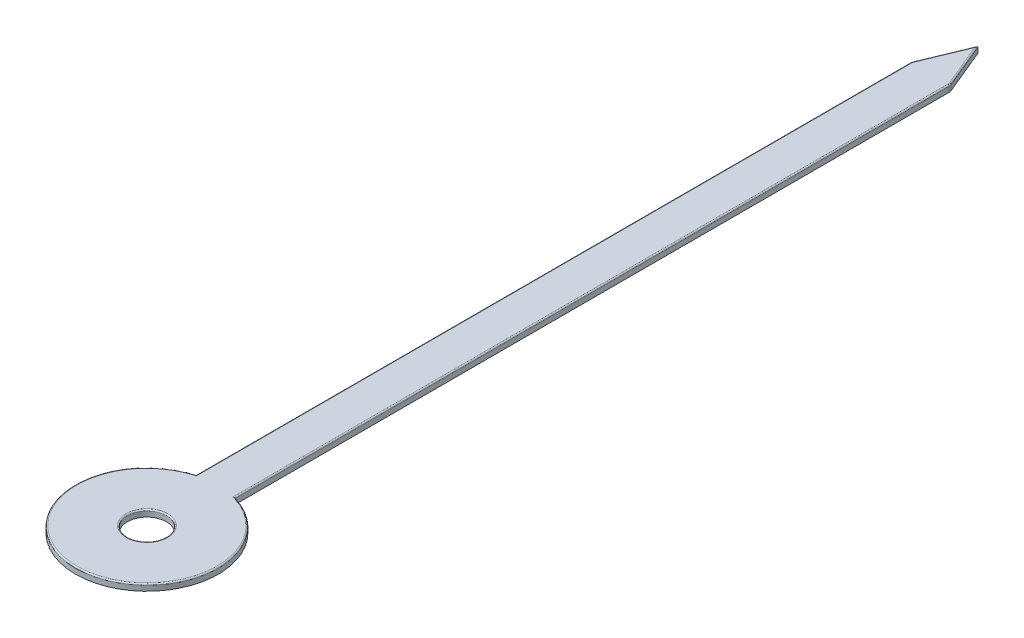
ISO-10303-21;
HEADER;
FILE_DESCRIPTION(('STEP AP214'),'2;1');
FILE_NAME('part.step','',(''),(''),'','','');
FILE_SCHEMA(('AUTOMOTIVE_DESIGN { 1 0 10303 214 1 1 1 1 }'));
ENDSEC;
DATA;
#1=APPLICATION_CONTEXT('core data for automotive mechanical design processes');
#2=APPLICATION_PROTOCOL_DEFINITION('international standard','automotive_design',2000,#1);
#3=PRODUCT_CONTEXT('',#1,'mechanical');
#4=PRODUCT('Part','Part','',(#3));
#5=PRODUCT_RELATED_PRODUCT_CATEGORY('part','',(#4));
#6=PRODUCT_DEFINITION_FORMATION('','',#4);
#7=PRODUCT_DEFINITION_CONTEXT('part definition',#1,'design');
#8=PRODUCT_DEFINITION('design','',#6,#7);
#9=PRODUCT_DEFINITION_SHAPE('','',#8);
#10=(LENGTH_UNIT() NAMED_UNIT(*) SI_UNIT(.MILLI.,.METRE.));
#11=(NAMED_UNIT(*) PLANE_ANGLE_UNIT() SI_UNIT($,.RADIAN.));
#12=(NAMED_UNIT(*) SI_UNIT($,.STERADIAN.) SOLID_ANGLE_UNIT());
#13=UNCERTAINTY_MEASURE_WITH_UNIT(LENGTH_MEASURE(1.E-05),#10,'distance_accuracy_value','');
#14=(GEOMETRIC_REPRESENTATION_CONTEXT(3) GLOBAL_UNCERTAINTY_ASSIGNED_CONTEXT((#13)) GLOBAL_UNIT_ASSIGNED_CONTEXT((#10,
#11,#12)) REPRESENTATION_CONTEXT('',''));
#15=CARTESIAN_POINT('',(0.,0.,0.));
#16=DIRECTION('',(0.,0.,1.));
#17=DIRECTION('',(1.,0.,0.));
#18=AXIS2_PLACEMENT_3D('',#15,#16,#17);
#19=CARTESIAN_POINT('',(0.,0.1,0.));
#20=DIRECTION('',(0.,1.,0.));
#21=DIRECTION('',(0.,0.,1.));
#22=AXIS2_PLACEMENT_3D('',#19,#20,#21);
#23=PLANE('',#22);
#24=CARTESIAN_POINT('',(0.,0.1,0.));
#25=DIRECTION('',(0.,1.,0.));
#26=DIRECTION('',(0.,0.,1.));
#27=AXIS2_PLACEMENT_3D('',#24,#25,#26);
#28=CIRCLE('',#27,0.32);
#29=CARTESIAN_POINT('',(0.,0.1,0.32));
#30=VERTEX_POINT('',#29);
#31=EDGE_CURVE('E188',#30,#30,#28,.F.);
#32=ORIENTED_EDGE('',*,*,#31,.T.);
#33=EDGE_LOOP('',(#32));
#34=FACE_BOUND('',#33,.T.);
#35=CARTESIAN_POINT('',(0.2,0.1,-12.0558446945501));
#36=DIRECTION('',(0.,1.,0.));
#37=DIRECTION('',(0.,0.,1.));
#38=AXIS2_PLACEMENT_3D('',#35,#36,#37);
#39=CIRCLE('',#38,0.08);
#40=CARTESIAN_POINT('',(0.28,0.1,-12.0558446945501));
#41=VERTEX_POINT('',#40);
#42=CARTESIAN_POINT('',(0.273910362600903,0.1,-12.0864593691393));
#43=VERTEX_POINT('',#42);
#44=EDGE_CURVE('E183',#41,#43,#39,.T.);
#45=ORIENTED_EDGE('',*,*,#44,.T.);
#46=DIRECTION('',(-0.382683432365087,0.,-0.923879532511288));
#47=VECTOR('',#46,1.);
#48=CARTESIAN_POINT('',(-0.0184775906502269,0.1,-12.7923463313527));
#49=LINE('',#48,#47);
#50=CARTESIAN_POINT('',(0.,0.1,-12.7477374814049));
#51=VERTEX_POINT('',#50);
#52=EDGE_CURVE('E185',#43,#51,#49,.T.);
#53=ORIENTED_EDGE('',*,*,#52,.T.);
#54=DIRECTION('',(-0.382683432365087,0.,0.923879532511288));
#55=VECTOR('',#54,1.);
#56=CARTESIAN_POINT('',(-0.273910362600902,0.1,-12.0864593691393));
#57=LINE('',#56,#55);
#58=CARTESIAN_POINT('',(-0.273910362600902,0.1,-12.0864593691393));
#59=VERTEX_POINT('',#58);
#60=EDGE_CURVE('E173',#51,#59,#57,.T.);
#61=ORIENTED_EDGE('',*,*,#60,.T.);
#62=CARTESIAN_POINT('',(-0.2,0.1,-12.0558446945501));
#63=DIRECTION('',(0.,1.,0.));
#64=DIRECTION('',(0.,0.,1.));
#65=AXIS2_PLACEMENT_3D('',#62,#63,#64);
#66=CIRCLE('',#65,0.08);
#67=CARTESIAN_POINT('',(-0.28,0.1,-12.0558446945501));
#68=VERTEX_POINT('',#67);
#69=EDGE_CURVE('E175',#59,#68,#66,.T.);
#70=ORIENTED_EDGE('',*,*,#69,.T.);
#71=DIRECTION('',(0.,0.,1.));
#72=VECTOR('',#71,1.);
#73=CARTESIAN_POINT('',(-0.28,0.1,-1.05830052442584));
#74=LINE('',#73,#72);
#75=CARTESIAN_POINT('',(-0.28,0.1,-1.04307238483242));
#76=VERTEX_POINT('',#75);
#77=EDGE_CURVE('E177',#68,#76,#74,.T.);
#78=ORIENTED_EDGE('',*,*,#77,.T.);
#79=CARTESIAN_POINT('',(0.,0.1,0.));
#80=DIRECTION('',(0.,1.,0.));
#81=DIRECTION('',(0.,0.,1.));
#82=AXIS2_PLACEMENT_3D('',#79,#80,#81);
#83=CIRCLE('',#82,1.08);
#84=CARTESIAN_POINT('',(0.28,0.1,-1.04307238483242));
#85=VERTEX_POINT('',#84);
#86=EDGE_CURVE('E179',#76,#85,#83,.T.);
#87=ORIENTED_EDGE('',*,*,#86,.T.);
#88=DIRECTION('',(0.,0.,-1.));
#89=VECTOR('',#88,1.);
#90=CARTESIAN_POINT('',(0.28,0.1,-12.0558446945501));
#91=LINE('',#90,#89);
#92=EDGE_CURVE('E181',#85,#41,#91,.T.);
#93=ORIENTED_EDGE('',*,*,#92,.T.);
#94=EDGE_LOOP('',(#45,#53,#61,#70,#78,#87,#93));
#95=FACE_BOUND('',#94,.T.);
#96=ADVANCED_FACE('F33',(#34,#95),#23,.T.);
#97=CARTESIAN_POINT('',(0.,0.,0.));
#98=DIRECTION('',(0.,1.,0.));
#99=DIRECTION('',(0.,0.,1.));
#100=AXIS2_PLACEMENT_3D('',#97,#98,#99);
#101=PLANE('',#100);
#102=DIRECTION('',(0.,0.,1.));
#103=VECTOR('',#102,1.);
#104=CARTESIAN_POINT('',(-0.3,0.,-1.05830052442584));
#105=LINE('',#104,#103);
#106=CARTESIAN_POINT('',(-0.3,0.,-12.0558446945501));
#107=VERTEX_POINT('',#106);
#108=CARTESIAN_POINT('',(-0.3,0.,-1.05830052442584));
#109=VERTEX_POINT('',#108);
#110=EDGE_CURVE('E145',#107,#109,#105,.T.);
#111=ORIENTED_EDGE('',*,*,#110,.F.);
#112=CARTESIAN_POINT('',(-0.2,0.,-12.0558446945501));
#113=DIRECTION('',(0.,1.,0.));
#114=DIRECTION('',(0.,0.,1.));
#115=AXIS2_PLACEMENT_3D('',#112,#113,#114);
#116=CIRCLE('',#115,0.1);
#117=CARTESIAN_POINT('',(-0.292387953251128,0.,-12.0941130377866));
#118=VERTEX_POINT('',#117);
#119=EDGE_CURVE('E144',#107,#118,#116,.F.);
#120=ORIENTED_EDGE('',*,*,#119,.T.);
#121=DIRECTION('',(-0.382683432365087,0.,0.923879532511288));
#122=VECTOR('',#121,1.);
#123=CARTESIAN_POINT('',(-0.3,0.,-12.0757359312881));
#124=LINE('',#123,#122);
#125=CARTESIAN_POINT('',(0.,0.,-12.8));
#126=VERTEX_POINT('',#125);
#127=EDGE_CURVE('E123',#126,#118,#124,.T.);
#128=ORIENTED_EDGE('',*,*,#127,.F.);
#129=DIRECTION('',(-0.382683432365087,0.,-0.923879532511288));
#130=VECTOR('',#129,1.);
#131=CARTESIAN_POINT('',(0.,0.,-12.8));
#132=LINE('',#131,#130);
#133=CARTESIAN_POINT('',(0.292387953251129,0.,-12.0941130377866));
#134=VERTEX_POINT('',#133);
#135=EDGE_CURVE('E132',#134,#126,#132,.T.);
#136=ORIENTED_EDGE('',*,*,#135,.F.);
#137=CARTESIAN_POINT('',(0.2,0.,-12.0558446945501));
#138=DIRECTION('',(0.,1.,0.));
#139=DIRECTION('',(0.,0.,1.));
#140=AXIS2_PLACEMENT_3D('',#137,#138,#139);
#141=CIRCLE('',#140,0.1);
#142=CARTESIAN_POINT('',(0.3,0.,-12.0558446945501));
#143=VERTEX_POINT('',#142);
#144=EDGE_CURVE('E161',#134,#143,#141,.F.);
#145=ORIENTED_EDGE('',*,*,#144,.T.);
#146=DIRECTION('',(0.,0.,-1.));
#147=VECTOR('',#146,1.);
#148=CARTESIAN_POINT('',(0.3,0.,-1.05830052442584));
#149=LINE('',#148,#147);
#150=CARTESIAN_POINT('',(0.300000000000001,0.,-1.05830052442584));
#151=VERTEX_POINT('',#150);
#152=EDGE_CURVE('E154',#151,#143,#149,.T.);
#153=ORIENTED_EDGE('',*,*,#152,.F.);
#154=CARTESIAN_POINT('',(0.,0.,0.));
#155=DIRECTION('',(0.,1.,0.));
#156=DIRECTION('',(0.,0.,1.));
#157=AXIS2_PLACEMENT_3D('',#154,#155,#156);
#158=CIRCLE('',#157,1.1);
#159=EDGE_CURVE('E148',#109,#151,#158,.T.);
#160=ORIENTED_EDGE('',*,*,#159,.F.);
#161=EDGE_LOOP('',(#111,#120,#128,#136,#145,#153,#160));
#162=FACE_BOUND('',#161,.T.);
#163=CARTESIAN_POINT('',(0.,0.,0.));
#164=DIRECTION('',(0.,1.,0.));
#165=DIRECTION('',(0.,0.,1.));
#166=AXIS2_PLACEMENT_3D('',#163,#164,#165);
#167=CIRCLE('',#166,0.3);
#168=CARTESIAN_POINT('',(0.,0.,0.3));
#169=VERTEX_POINT('',#168);
#170=EDGE_CURVE('E138',#169,#169,#167,.T.);
#171=ORIENTED_EDGE('',*,*,#170,.T.);
#172=EDGE_LOOP('',(#171));
#173=FACE_BOUND('',#172,.T.);
#174=ADVANCED_FACE('F141',(#162,#173),#101,.F.);
#175=CARTESIAN_POINT('',(0.,0.1,-12.8));
#176=DIRECTION('',(-0.923879532511288,0.,0.382683432365087));
#177=DIRECTION('',(0.382683432365087,0.,0.923879532511288));
#178=AXIS2_PLACEMENT_3D('',#175,#176,#177);
#179=PLANE('',#178);
#180=DIRECTION('',(0.,-1.,0.));
#181=VECTOR('',#180,1.);
#182=CARTESIAN_POINT('',(0.,0.1,-12.8));
#183=LINE('',#182,#181);
#184=CARTESIAN_POINT('',(0.,0.08,-12.8));
#185=VERTEX_POINT('',#184);
#186=EDGE_CURVE('E119',#185,#126,#183,.T.);
#187=ORIENTED_EDGE('',*,*,#186,.F.);
#188=DIRECTION('',(-0.382683432365087,0.,-0.923879532511288));
#189=VECTOR('',#188,1.);
#190=CARTESIAN_POINT('',(0.292387953251129,0.08,-12.0941130377866));
#191=LINE('',#190,#189);
#192=CARTESIAN_POINT('',(0.292387953251129,0.08,-12.0941130377866));
#193=VERTEX_POINT('',#192);
#194=EDGE_CURVE('E191',#185,#193,#191,.F.);
#195=ORIENTED_EDGE('',*,*,#194,.T.);
#196=DIRECTION('',(0.,-1.,0.));
#197=VECTOR('',#196,1.);
#198=CARTESIAN_POINT('',(0.292387953251129,0.1,-12.0941130377866));
#199=LINE('',#198,#197);
#200=EDGE_CURVE('E135',#193,#134,#199,.T.);
#201=ORIENTED_EDGE('',*,*,#200,.T.);
#202=ORIENTED_EDGE('',*,*,#135,.T.);
#203=EDGE_LOOP('',(#187,#195,#201,#202));
#204=FACE_BOUND('',#203,.T.);
#205=ADVANCED_FACE('F133',(#204),#179,.F.);
#206=CARTESIAN_POINT('',(-0.3,0.1,-12.0757359312881));
#207=DIRECTION('',(0.923879532511288,0.,0.382683432365087));
#208=DIRECTION('',(0.382683432365087,0.,-0.923879532511288));
#209=AXIS2_PLACEMENT_3D('',#206,#207,#208);
#210=PLANE('',#209);
#211=DIRECTION('',(0.,-1.,0.));
#212=VECTOR('',#211,1.);
#213=CARTESIAN_POINT('',(-0.292387953251128,0.1,-12.0941130377866));
#214=LINE('',#213,#212);
#215=CARTESIAN_POINT('',(-0.292387953251128,0.08,-12.0941130377866));
#216=VERTEX_POINT('',#215);
#217=EDGE_CURVE('E164',#118,#216,#214,.F.);
#218=ORIENTED_EDGE('',*,*,#217,.T.);
#219=DIRECTION('',(-0.382683432365087,0.,0.923879532511288));
#220=VECTOR('',#219,1.);
#221=CARTESIAN_POINT('',(0.,0.08,-12.8));
#222=LINE('',#221,#220);
#223=EDGE_CURVE('E11',#216,#185,#222,.F.);
#224=ORIENTED_EDGE('',*,*,#223,.T.);
#225=ORIENTED_EDGE('',*,*,#186,.T.);
#226=ORIENTED_EDGE('',*,*,#127,.T.);
#227=EDGE_LOOP('',(#218,#224,#225,#226));
#228=FACE_BOUND('',#227,.T.);
#229=ADVANCED_FACE('F121',(#228),#210,.F.);
#230=CARTESIAN_POINT('',(-0.3,0.1,-1.05830052442584));
#231=DIRECTION('',(1.,0.,0.));
#232=DIRECTION('',(0.,0.,-1.));
#233=AXIS2_PLACEMENT_3D('',#230,#231,#232);
#234=PLANE('',#233);
#235=DIRECTION('',(0.,-1.,0.));
#236=VECTOR('',#235,1.);
#237=CARTESIAN_POINT('',(-0.3,0.1,-1.05830052442584));
#238=LINE('',#237,#236);
#239=CARTESIAN_POINT('',(-0.3,0.08,-1.05830052442584));
#240=VERTEX_POINT('',#239);
#241=EDGE_CURVE('E129',#240,#109,#238,.T.);
#242=ORIENTED_EDGE('',*,*,#241,.F.);
#243=DIRECTION('',(0.,0.,1.));
#244=VECTOR('',#243,1.);
#245=CARTESIAN_POINT('',(-0.3,0.08,-12.0558446945501));
#246=LINE('',#245,#244);
#247=CARTESIAN_POINT('',(-0.3,0.08,-12.0558446945501));
#248=VERTEX_POINT('',#247);
#249=EDGE_CURVE('E61',#240,#248,#246,.F.);
#250=ORIENTED_EDGE('',*,*,#249,.T.);
#251=DIRECTION('',(0.,-1.,0.));
#252=VECTOR('',#251,1.);
#253=CARTESIAN_POINT('',(-0.3,0.1,-12.0558446945501));
#254=LINE('',#253,#252);
#255=EDGE_CURVE('E128',#248,#107,#254,.T.);
#256=ORIENTED_EDGE('',*,*,#255,.T.);
#257=ORIENTED_EDGE('',*,*,#110,.T.);
#258=EDGE_LOOP('',(#242,#250,#256,#257));
#259=FACE_BOUND('',#258,.T.);
#260=ADVANCED_FACE('F255',(#259),#234,.F.);
#261=CARTESIAN_POINT('',(0.,0.1,0.));
#262=DIRECTION('',(0.,-1.,0.));
#263=DIRECTION('',(0.,0.,-1.));
#264=AXIS2_PLACEMENT_3D('',#261,#262,#263);
#265=CYLINDRICAL_SURFACE('',#264,1.1);
#266=DIRECTION('',(0.,-1.,0.));
#267=VECTOR('',#266,1.);
#268=CARTESIAN_POINT('',(0.300000000000001,0.1,-1.05830052442584));
#269=LINE('',#268,#267);
#270=CARTESIAN_POINT('',(0.300000000000001,0.08,-1.05830052442584));
#271=VERTEX_POINT('',#270);
#272=EDGE_CURVE('E157',#271,#151,#269,.T.);
#273=ORIENTED_EDGE('',*,*,#272,.F.);
#274=CARTESIAN_POINT('',(0.,0.08,0.));
#275=DIRECTION('',(0.,1.,0.));
#276=DIRECTION('',(0.,0.,1.));
#277=AXIS2_PLACEMENT_3D('',#274,#275,#276);
#278=CIRCLE('',#277,1.1);
#279=EDGE_CURVE('E197',#271,#240,#278,.F.);
#280=ORIENTED_EDGE('',*,*,#279,.T.);
#281=ORIENTED_EDGE('',*,*,#241,.T.);
#282=ORIENTED_EDGE('',*,*,#159,.T.);
#283=EDGE_LOOP('',(#273,#280,#281,#282));
#284=FACE_BOUND('',#283,.T.);
#285=ADVANCED_FACE('F251',(#284),#265,.T.);
#286=CARTESIAN_POINT('',(0.3,0.1,-1.05830052442584));
#287=DIRECTION('',(-1.,0.,0.));
#288=DIRECTION('',(0.,0.,1.));
#289=AXIS2_PLACEMENT_3D('',#286,#287,#288);
#290=PLANE('',#289);
#291=DIRECTION('',(0.,-1.,0.));
#292=VECTOR('',#291,1.);
#293=CARTESIAN_POINT('',(0.3,0.1,-12.0558446945501));
#294=LINE('',#293,#292);
#295=CARTESIAN_POINT('',(0.3,0.08,-12.0558446945501));
#296=VERTEX_POINT('',#295);
#297=EDGE_CURVE('E167',#143,#296,#294,.F.);
#298=ORIENTED_EDGE('',*,*,#297,.T.);
#299=DIRECTION('',(0.,0.,-1.));
#300=VECTOR('',#299,1.);
#301=CARTESIAN_POINT('',(0.3,0.08,-1.05830052442584));
#302=LINE('',#301,#300);
#303=EDGE_CURVE('E195',#296,#271,#302,.F.);
#304=ORIENTED_EDGE('',*,*,#303,.T.);
#305=ORIENTED_EDGE('',*,*,#272,.T.);
#306=ORIENTED_EDGE('',*,*,#152,.T.);
#307=EDGE_LOOP('',(#298,#304,#305,#306));
#308=FACE_BOUND('',#307,.T.);
#309=ADVANCED_FACE('F248',(#308),#290,.F.);
#310=CARTESIAN_POINT('',(0.,0.1,0.));
#311=DIRECTION('',(0.,-1.,0.));
#312=DIRECTION('',(0.,0.,-1.));
#313=AXIS2_PLACEMENT_3D('',#310,#311,#312);
#314=CYLINDRICAL_SURFACE('',#313,0.3);
#315=CARTESIAN_POINT('',(0.,0.08,0.));
#316=DIRECTION('',(0.,1.,0.));
#317=DIRECTION('',(0.,0.,1.));
#318=AXIS2_PLACEMENT_3D('',#315,#316,#317);
#319=CIRCLE('',#318,0.3);
#320=CARTESIAN_POINT('',(0.,0.08,0.3));
#321=VERTEX_POINT('',#320);
#322=EDGE_CURVE('E170',#321,#321,#319,.T.);
#323=ORIENTED_EDGE('',*,*,#322,.T.);
#324=EDGE_LOOP('',(#323));
#325=FACE_BOUND('',#324,.T.);
#326=ORIENTED_EDGE('',*,*,#170,.F.);
#327=EDGE_LOOP('',(#326));
#328=FACE_BOUND('',#327,.T.);
#329=ADVANCED_FACE('F246',(#325,#328),#314,.F.);
#330=CARTESIAN_POINT('',(-0.2,0.1,-12.0558446945501));
#331=DIRECTION('',(0.,-1.,0.));
#332=DIRECTION('',(0.,0.,-1.));
#333=AXIS2_PLACEMENT_3D('',#330,#331,#332);
#334=CYLINDRICAL_SURFACE('',#333,0.1);
#335=ORIENTED_EDGE('',*,*,#255,.F.);
#336=CARTESIAN_POINT('',(-0.2,0.08,-12.0558446945501));
#337=DIRECTION('',(0.,1.,0.));
#338=DIRECTION('',(0.,0.,1.));
#339=AXIS2_PLACEMENT_3D('',#336,#337,#338);
#340=CIRCLE('',#339,0.1);
#341=EDGE_CURVE('E46',#248,#216,#340,.F.);
#342=ORIENTED_EDGE('',*,*,#341,.T.);
#343=ORIENTED_EDGE('',*,*,#217,.F.);
#344=ORIENTED_EDGE('',*,*,#119,.F.);
#345=EDGE_LOOP('',(#335,#342,#343,#344));
#346=FACE_BOUND('',#345,.T.);
#347=ADVANCED_FACE('F263',(#346),#334,.T.);
#348=CARTESIAN_POINT('',(0.2,0.1,-12.0558446945501));
#349=DIRECTION('',(0.,-1.,0.));
#350=DIRECTION('',(0.,0.,-1.));
#351=AXIS2_PLACEMENT_3D('',#348,#349,#350);
#352=CYLINDRICAL_SURFACE('',#351,0.1);
#353=ORIENTED_EDGE('',*,*,#200,.F.);
#354=CARTESIAN_POINT('',(0.2,0.08,-12.0558446945501));
#355=DIRECTION('',(0.,1.,0.));
#356=DIRECTION('',(0.,0.,1.));
#357=AXIS2_PLACEMENT_3D('',#354,#355,#356);
#358=CIRCLE('',#357,0.1);
#359=EDGE_CURVE('E193',#193,#296,#358,.F.);
#360=ORIENTED_EDGE('',*,*,#359,.T.);
#361=ORIENTED_EDGE('',*,*,#297,.F.);
#362=ORIENTED_EDGE('',*,*,#144,.F.);
#363=EDGE_LOOP('',(#353,#360,#361,#362));
#364=FACE_BOUND('',#363,.T.);
#365=ADVANCED_FACE('F233',(#364),#352,.T.);
#366=CARTESIAN_POINT('',(0.,0.08,0.));
#367=DIRECTION('',(0.,1.,0.));
#368=DIRECTION('',(0.,0.,1.));
#369=AXIS2_PLACEMENT_3D('',#366,#367,#368);
#370=TOROIDAL_SURFACE('',#369,0.32,0.02);
#371=ORIENTED_EDGE('',*,*,#31,.F.);
#372=EDGE_LOOP('',(#371));
#373=FACE_BOUND('',#372,.T.);
#374=ORIENTED_EDGE('',*,*,#322,.F.);
#375=EDGE_LOOP('',(#374));
#376=FACE_BOUND('',#375,.T.);
#377=ADVANCED_FACE('F225',(#373,#376),#370,.T.);
#378=CARTESIAN_POINT('',(0.,0.08,0.));
#379=DIRECTION('',(0.,1.,0.));
#380=DIRECTION('',(0.,0.,1.));
#381=AXIS2_PLACEMENT_3D('',#378,#379,#380);
#382=TOROIDAL_SURFACE('',#381,1.08,0.02);
#383=CARTESIAN_POINT('',(0.300000000000001,0.08,-1.05830052442584));
#384=CARTESIAN_POINT('',(0.300001434378571,0.0809645688605814,-1.05830159455923));
#385=CARTESIAN_POINT('',(0.299930324263026,0.0819275496760335,-1.05824785472071));
#386=CARTESIAN_POINT('',(0.299654974451375,0.0838173916784719,-1.05803968620466));
#387=CARTESIAN_POINT('',(0.299451536768023,0.0847444350397026,-1.05788586410554));
#388=CARTESIAN_POINT('',(0.298923654477688,0.0865402750858273,-1.05748658820793));
#389=CARTESIAN_POINT('',(0.298599401405258,0.0874091614115095,-1.05724127944714));
#390=CARTESIAN_POINT('',(0.297846766369355,0.0890734614440091,-1.05667161774031));
#391=CARTESIAN_POINT('',(0.297418246898693,0.0898687761966275,-1.05634716041116));
#392=CARTESIAN_POINT('',(0.296441672727979,0.0914269950518833,-1.05560732379475));
#393=CARTESIAN_POINT('',(0.295887303948224,0.092183620319212,-1.05518713438536));
#394=CARTESIAN_POINT('',(0.294700543420221,0.0935920192230769,-1.05428699714139));
#395=CARTESIAN_POINT('',(0.294068136897373,0.0942437729506876,-1.05380703799065));
#396=CARTESIAN_POINT('',(0.292615145226683,0.0955560922797399,-1.05270346799454));
#397=CARTESIAN_POINT('',(0.29178177545773,0.0961941800877155,-1.05206999351507));
#398=CARTESIAN_POINT('',(0.290053252420723,0.0973204668900287,-1.05075479452971));
#399=CARTESIAN_POINT('',(0.289158017136094,0.0978084620464117,-1.05007300594098));
#400=CARTESIAN_POINT('',(0.287035539936965,0.0987684488891805,-1.04845491380227));
#401=CARTESIAN_POINT('',(0.285793011282463,0.0991863320057,-1.0475064398017));
#402=CARTESIAN_POINT('',(0.283274570186935,0.0997723508641512,-1.04558129383254));
#403=CARTESIAN_POINT('',(0.281998707810397,0.0999408414420839,-1.04460466394651));
#404=CARTESIAN_POINT('',(0.280481479306558,0.0999956527269803,-1.04344161719734));
#405=CARTESIAN_POINT('',(0.280240693528984,0.0999999967729995,-1.04325699080301));
#406=CARTESIAN_POINT('',(0.28,0.1,-1.04307238483242));
#407=B_SPLINE_CURVE_WITH_KNOTS('',3,(#383,#384,#385,#386,#387,#388,#389,#390,#391,#392,#393,
#394,#395,#396,#397,#398,#399,#400,#401,#402,#403,#404,#405,#406),.UNSPECIFIED.,.F.,.F.,(4,2,2,
2,2,2,2,2,2,2,2,4),(0.,0.00288708863402028,0.00575684018464619,0.00862206140247126,
0.0114910819703431,0.0145631804207026,0.017635861395187,0.0213003193172393,0.0249697321160903,
0.0298023186017101,0.034628022645949,0.035538238261908),.UNSPECIFIED.);
#408=EDGE_CURVE('E213',#85,#271,#407,.F.);
#409=ORIENTED_EDGE('',*,*,#408,.F.);
#410=ORIENTED_EDGE('',*,*,#86,.F.);
#411=CARTESIAN_POINT('',(-0.3,0.08,-1.05830052442584));
#412=CARTESIAN_POINT('',(-0.300001434378571,0.0809645688605814,-1.05830159455923));
#413=CARTESIAN_POINT('',(-0.299930324263026,0.0819275496760335,-1.05824785472071));
#414=CARTESIAN_POINT('',(-0.299654974451375,0.0838173916784719,-1.05803968620466));
#415=CARTESIAN_POINT('',(-0.299451536768023,0.0847444350397026,-1.05788586410554));
#416=CARTESIAN_POINT('',(-0.298923654477688,0.0865402750858273,-1.05748658820793));
#417=CARTESIAN_POINT('',(-0.298599401405258,0.0874091614115095,-1.05724127944714));
#418=CARTESIAN_POINT('',(-0.297846766369355,0.0890734614440091,-1.05667161774031));
#419=CARTESIAN_POINT('',(-0.297418246898693,0.0898687761966275,-1.05634716041116));
#420=CARTESIAN_POINT('',(-0.296441672727979,0.0914269950518833,-1.05560732379475));
#421=CARTESIAN_POINT('',(-0.295887303948224,0.092183620319212,-1.05518713438536));
#422=CARTESIAN_POINT('',(-0.294700543420221,0.0935920192230769,-1.05428699714139));
#423=CARTESIAN_POINT('',(-0.294068136897373,0.0942437729506876,-1.05380703799065));
#424=CARTESIAN_POINT('',(-0.292615145226683,0.0955560922797399,-1.05270346799454));
#425=CARTESIAN_POINT('',(-0.29178177545773,0.0961941800877155,-1.05206999351507));
#426=CARTESIAN_POINT('',(-0.290053252420723,0.0973204668900287,-1.05075479452971));
#427=CARTESIAN_POINT('',(-0.289158017136094,0.0978084620464117,-1.05007300594098));
#428=CARTESIAN_POINT('',(-0.287035539936965,0.0987684488891805,-1.04845491380227));
#429=CARTESIAN_POINT('',(-0.285793011282463,0.0991863320057,-1.0475064398017));
#430=CARTESIAN_POINT('',(-0.283274570186935,0.0997723508641512,-1.04558129383254));
#431=CARTESIAN_POINT('',(-0.281998707810397,0.0999408414420839,-1.04460466394651));
#432=CARTESIAN_POINT('',(-0.280481479306558,0.0999956527269803,-1.04344161719734));
#433=CARTESIAN_POINT('',(-0.280240693528984,0.0999999967729995,-1.04325699080301));
#434=CARTESIAN_POINT('',(-0.28,0.1,-1.04307238483242));
#435=B_SPLINE_CURVE_WITH_KNOTS('',3,(#411,#412,#413,#414,#415,#416,#417,#418,#419,#420,#421,
#422,#423,#424,#425,#426,#427,#428,#429,#430,#431,#432,#433,#434),.UNSPECIFIED.,.F.,.F.,(4,2,2,
2,2,2,2,2,2,2,2,4),(0.,0.00288708863402025,0.00575684018464616,0.00862206140247123,
0.0114910819703431,0.0145631804207026,0.017635861395187,0.0213003193172392,0.0249697321160902,
0.0298023186017101,0.0346280226459489,0.0355382382619079),.UNSPECIFIED.);
#436=EDGE_CURVE('E38',#240,#76,#435,.T.);
#437=ORIENTED_EDGE('',*,*,#436,.F.);
#438=ORIENTED_EDGE('',*,*,#279,.F.);
#439=EDGE_LOOP('',(#409,#410,#437,#438));
#440=FACE_BOUND('',#439,.T.);
#441=ADVANCED_FACE('F222',(#440),#382,.T.);
#442=CARTESIAN_POINT('',(-0.28,0.08,0.));
#443=DIRECTION('',(0.,0.,-1.));
#444=DIRECTION('',(-1.,0.,0.));
#445=AXIS2_PLACEMENT_3D('',#442,#443,#444);
#446=CYLINDRICAL_SURFACE('',#445,0.02);
#447=ORIENTED_EDGE('',*,*,#436,.T.);
#448=ORIENTED_EDGE('',*,*,#77,.F.);
#449=CARTESIAN_POINT('',(-0.28,0.08,-12.0558446945501));
#450=DIRECTION('',(0.,0.,-1.));
#451=DIRECTION('',(-1.,0.,0.));
#452=AXIS2_PLACEMENT_3D('',#449,#450,#451);
#453=CIRCLE('',#452,0.02);
#454=EDGE_CURVE('E211',#248,#68,#453,.T.);
#455=ORIENTED_EDGE('',*,*,#454,.F.);
#456=ORIENTED_EDGE('',*,*,#249,.F.);
#457=EDGE_LOOP('',(#447,#448,#455,#456));
#458=FACE_BOUND('',#457,.T.);
#459=ADVANCED_FACE('F35',(#458),#446,.T.);
#460=CARTESIAN_POINT('',(0.28,0.08,0.));
#461=DIRECTION('',(0.,0.,1.));
#462=DIRECTION('',(1.,0.,0.));
#463=AXIS2_PLACEMENT_3D('',#460,#461,#462);
#464=CYLINDRICAL_SURFACE('',#463,0.02);
#465=ORIENTED_EDGE('',*,*,#408,.T.);
#466=ORIENTED_EDGE('',*,*,#303,.F.);
#467=CARTESIAN_POINT('',(0.28,0.08,-12.0558446945501));
#468=DIRECTION('',(0.,0.,-1.));
#469=DIRECTION('',(-1.,0.,0.));
#470=AXIS2_PLACEMENT_3D('',#467,#468,#469);
#471=CIRCLE('',#470,0.02);
#472=EDGE_CURVE('E208',#41,#296,#471,.T.);
#473=ORIENTED_EDGE('',*,*,#472,.F.);
#474=ORIENTED_EDGE('',*,*,#92,.F.);
#475=EDGE_LOOP('',(#465,#466,#473,#474));
#476=FACE_BOUND('',#475,.T.);
#477=ADVANCED_FACE('F219',(#476),#464,.T.);
#478=CARTESIAN_POINT('',(-0.2,0.08,-12.0558446945501));
#479=DIRECTION('',(0.,1.,0.));
#480=DIRECTION('',(0.,0.,1.));
#481=AXIS2_PLACEMENT_3D('',#478,#479,#480);
#482=TOROIDAL_SURFACE('',#481,0.08,0.02);
#483=ORIENTED_EDGE('',*,*,#454,.T.);
#484=ORIENTED_EDGE('',*,*,#69,.F.);
#485=CARTESIAN_POINT('',(-0.273910362600903,0.08,-12.0864593691393));
#486=DIRECTION('',(0.382683432365109,0.,-0.923879532511279));
#487=DIRECTION('',(-0.923879532511279,0.,-0.382683432365109));
#488=AXIS2_PLACEMENT_3D('',#485,#486,#487);
#489=CIRCLE('',#488,0.02);
#490=EDGE_CURVE('E205',#216,#59,#489,.T.);
#491=ORIENTED_EDGE('',*,*,#490,.F.);
#492=ORIENTED_EDGE('',*,*,#341,.F.);
#493=EDGE_LOOP('',(#483,#484,#491,#492));
#494=FACE_BOUND('',#493,.T.);
#495=ADVANCED_FACE('F279',(#494),#482,.T.);
#496=CARTESIAN_POINT('',(0.2,0.08,-12.0558446945501));
#497=DIRECTION('',(0.,1.,0.));
#498=DIRECTION('',(0.,0.,1.));
#499=AXIS2_PLACEMENT_3D('',#496,#497,#498);
#500=TOROIDAL_SURFACE('',#499,0.08,0.02);
#501=ORIENTED_EDGE('',*,*,#472,.T.);
#502=ORIENTED_EDGE('',*,*,#359,.F.);
#503=CARTESIAN_POINT('',(0.273910362600903,0.08,-12.0864593691393));
#504=DIRECTION('',(-0.382683432365113,0.,-0.923879532511277));
#505=DIRECTION('',(-0.923879532511277,0.,0.382683432365113));
#506=AXIS2_PLACEMENT_3D('',#503,#504,#505);
#507=CIRCLE('',#506,0.02);
#508=EDGE_CURVE('E203',#43,#193,#507,.T.);
#509=ORIENTED_EDGE('',*,*,#508,.F.);
#510=ORIENTED_EDGE('',*,*,#44,.F.);
#511=EDGE_LOOP('',(#501,#502,#509,#510));
#512=FACE_BOUND('',#511,.T.);
#513=ADVANCED_FACE('F276',(#512),#500,.T.);
#514=CARTESIAN_POINT('',(-4.50700580894365,0.08,-1.86686293175877));
#515=DIRECTION('',(0.382683432365087,0.,-0.923879532511288));
#516=DIRECTION('',(-0.923879532511288,0.,-0.382683432365087));
#517=AXIS2_PLACEMENT_3D('',#514,#515,#516);
#518=CYLINDRICAL_SURFACE('',#517,0.02);
#519=ORIENTED_EDGE('',*,*,#490,.T.);
#520=ORIENTED_EDGE('',*,*,#60,.F.);
#521=CARTESIAN_POINT('',(0.,0.08,-12.7477374814049));
#522=DIRECTION('',(1.,0.,0.));
#523=DIRECTION('',(0.,0.,-1.));
#524=AXIS2_PLACEMENT_3D('',#521,#522,#523);
#525=ELLIPSE('',#524,0.0522625185950554,0.02);
#526=EDGE_CURVE('E201',#185,#51,#525,.T.);
#527=ORIENTED_EDGE('',*,*,#526,.F.);
#528=ORIENTED_EDGE('',*,*,#223,.F.);
#529=EDGE_LOOP('',(#519,#520,#527,#528));
#530=FACE_BOUND('',#529,.T.);
#531=ADVANCED_FACE('F272',(#530),#518,.T.);
#532=CARTESIAN_POINT('',(4.50700580894365,0.08,-1.86686293175877));
#533=DIRECTION('',(0.382683432365087,0.,0.923879532511288));
#534=DIRECTION('',(0.923879532511288,0.,-0.382683432365087));
#535=AXIS2_PLACEMENT_3D('',#532,#533,#534);
#536=CYLINDRICAL_SURFACE('',#535,0.02);
#537=ORIENTED_EDGE('',*,*,#508,.T.);
#538=ORIENTED_EDGE('',*,*,#194,.F.);
#539=ORIENTED_EDGE('',*,*,#526,.T.);
#540=ORIENTED_EDGE('',*,*,#52,.F.);
#541=EDGE_LOOP('',(#537,#538,#539,#540));
#542=FACE_BOUND('',#541,.T.);
#543=ADVANCED_FACE('F269',(#542),#536,.T.);
#544=CLOSED_SHELL('',(#96,#174,#205,#229,#260,#285,#309,#329,#347,#365,#377,#441,#459,#477,#495,
#513,#531,#543));
#545=MANIFOLD_SOLID_BREP('B2',#544);
#546=ADVANCED_BREP_SHAPE_REPRESENTATION('',(#18,#545),#14);
#547=SHAPE_DEFINITION_REPRESENTATION(#9,#546);
ENDSEC;
END-ISO-10303-21;
